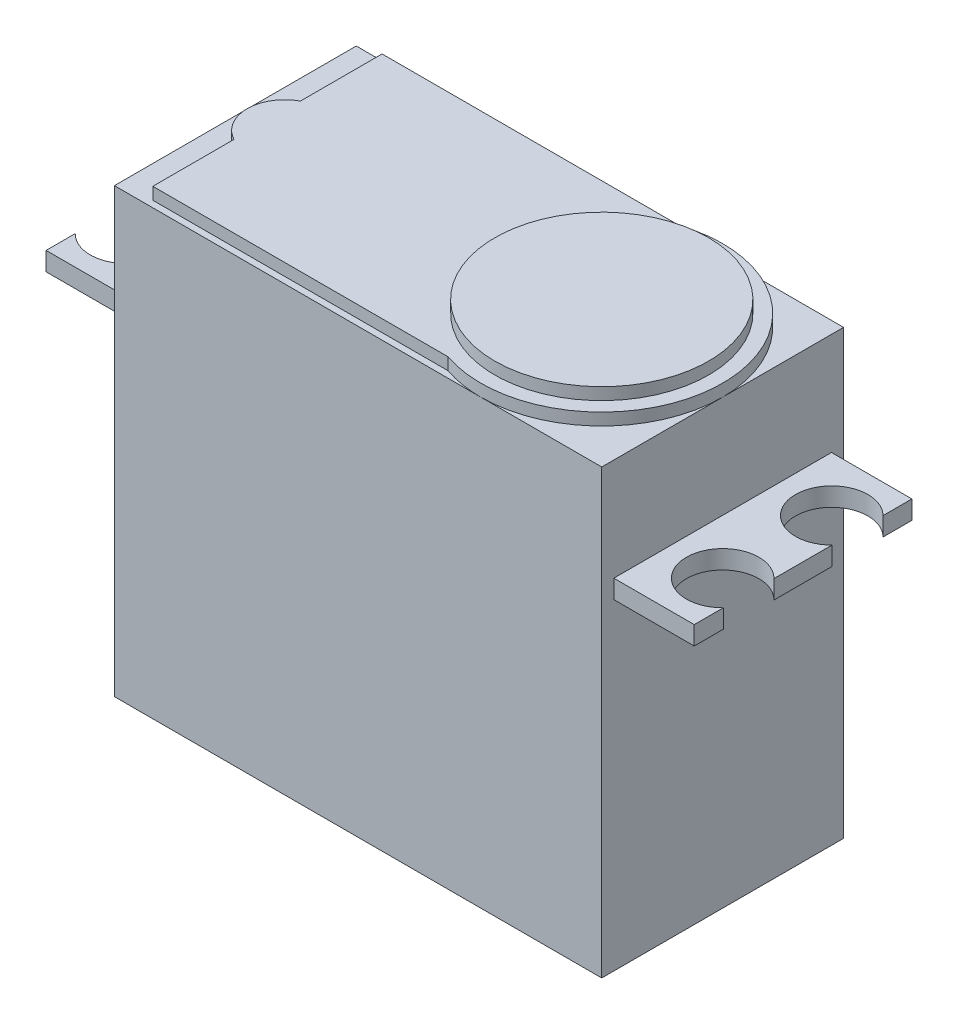
ISO-10303-21;
HEADER;
FILE_DESCRIPTION(('STEP AP214'),'2;1');
FILE_NAME('part.step','',(''),(''),'','','');
FILE_SCHEMA(('AUTOMOTIVE_DESIGN { 1 0 10303 214 1 1 1 1 }'));
ENDSEC;
DATA;
#1=APPLICATION_CONTEXT('core data for automotive mechanical design processes');
#2=APPLICATION_PROTOCOL_DEFINITION('international standard','automotive_design',2000,#1);
#3=PRODUCT_CONTEXT('',#1,'mechanical');
#4=PRODUCT('Part','Part','',(#3));
#5=PRODUCT_RELATED_PRODUCT_CATEGORY('part','',(#4));
#6=PRODUCT_DEFINITION_FORMATION('','',#4);
#7=PRODUCT_DEFINITION_CONTEXT('part definition',#1,'design');
#8=PRODUCT_DEFINITION('design','',#6,#7);
#9=PRODUCT_DEFINITION_SHAPE('','',#8);
#10=(LENGTH_UNIT() NAMED_UNIT(*) SI_UNIT(.MILLI.,.METRE.));
#11=(NAMED_UNIT(*) PLANE_ANGLE_UNIT() SI_UNIT($,.RADIAN.));
#12=(NAMED_UNIT(*) SI_UNIT($,.STERADIAN.) SOLID_ANGLE_UNIT());
#13=UNCERTAINTY_MEASURE_WITH_UNIT(LENGTH_MEASURE(1.E-05),#10,'distance_accuracy_value','');
#14=(GEOMETRIC_REPRESENTATION_CONTEXT(3) GLOBAL_UNCERTAINTY_ASSIGNED_CONTEXT((#13)) GLOBAL_UNIT_ASSIGNED_CONTEXT((#10,
#11,#12)) REPRESENTATION_CONTEXT('',''));
#15=CARTESIAN_POINT('',(0.,0.,0.));
#16=DIRECTION('',(0.,0.,1.));
#17=DIRECTION('',(1.,0.,0.));
#18=AXIS2_PLACEMENT_3D('',#15,#16,#17);
#19=CARTESIAN_POINT('',(-32.6652666539174,0.,0.));
#20=DIRECTION('',(-1.,0.,0.));
#21=DIRECTION('',(0.,0.,1.));
#22=AXIS2_PLACEMENT_3D('',#19,#20,#21);
#23=PLANE('',#22);
#24=DIRECTION('',(0.,1.,0.));
#25=VECTOR('',#24,1.);
#26=CARTESIAN_POINT('',(-32.6652666539174,0.,-2.7555980629411));
#27=LINE('',#26,#25);
#28=CARTESIAN_POINT('',(-32.6652666539174,26.6,-2.75559806294112));
#29=VERTEX_POINT('',#28);
#30=CARTESIAN_POINT('',(-32.6652666539174,28.1360986923512,-2.75559806294112));
#31=VERTEX_POINT('',#30);
#32=EDGE_CURVE('E12',#29,#31,#27,.T.);
#33=ORIENTED_EDGE('',*,*,#32,.F.);
#34=DIRECTION('',(0.,0.,1.));
#35=VECTOR('',#34,1.);
#36=CARTESIAN_POINT('',(-32.6652666539174,26.6,-9.3478456582319));
#37=LINE('',#36,#35);
#38=CARTESIAN_POINT('',(-32.6652666539174,26.6,2.05990674647734));
#39=VERTEX_POINT('',#38);
#40=EDGE_CURVE('E373',#29,#39,#37,.T.);
#41=ORIENTED_EDGE('',*,*,#40,.T.);
#42=DIRECTION('',(0.,1.,0.));
#43=VECTOR('',#42,1.);
#44=CARTESIAN_POINT('',(-32.6652666539174,0.,2.05990674647736));
#45=LINE('',#44,#43);
#46=CARTESIAN_POINT('',(-32.6652666539174,28.1360986923512,2.05990674647733));
#47=VERTEX_POINT('',#46);
#48=EDGE_CURVE('E581',#47,#39,#45,.F.);
#49=ORIENTED_EDGE('',*,*,#48,.F.);
#50=DIRECTION('',(0.,0.,-1.));
#51=VECTOR('',#50,1.);
#52=CARTESIAN_POINT('',(-32.6652666539174,28.1360986923512,-9.3478456582319));
#53=LINE('',#52,#51);
#54=EDGE_CURVE('E383',#47,#31,#53,.T.);
#55=ORIENTED_EDGE('',*,*,#54,.T.);
#56=EDGE_LOOP('',(#33,#41,#49,#55));
#57=FACE_BOUND('',#56,.T.);
#58=ADVANCED_FACE('F73',(#57),#23,.T.);
#59=DIRECTION('',(0.,1.,0.));
#60=VECTOR('',#59,1.);
#61=CARTESIAN_POINT('',(-32.6652666539174,0.,6.2444019370589));
#62=LINE('',#61,#60);
#63=CARTESIAN_POINT('',(-32.6652666539174,26.6,6.24440193705888));
#64=VERTEX_POINT('',#63);
#65=CARTESIAN_POINT('',(-32.6652666539174,28.1360986923512,6.24440193705888));
#66=VERTEX_POINT('',#65);
#67=EDGE_CURVE('E584',#64,#66,#62,.T.);
#68=ORIENTED_EDGE('',*,*,#67,.F.);
#69=CARTESIAN_POINT('',(-32.6652666539174,26.6,8.6521543417681));
#70=VERTEX_POINT('',#69);
#71=EDGE_CURVE('E367',#64,#70,#37,.T.);
#72=ORIENTED_EDGE('',*,*,#71,.T.);
#73=DIRECTION('',(0.,1.,0.));
#74=VECTOR('',#73,1.);
#75=CARTESIAN_POINT('',(-32.6652666539174,28.1360986923512,8.6521543417681));
#76=LINE('',#75,#74);
#77=CARTESIAN_POINT('',(-32.6652666539174,28.1360986923512,8.6521543417681));
#78=VERTEX_POINT('',#77);
#79=EDGE_CURVE('E372',#70,#78,#76,.T.);
#80=ORIENTED_EDGE('',*,*,#79,.T.);
#81=EDGE_CURVE('E378',#78,#66,#53,.T.);
#82=ORIENTED_EDGE('',*,*,#81,.T.);
#83=EDGE_LOOP('',(#68,#72,#80,#82));
#84=FACE_BOUND('',#83,.T.);
#85=ADVANCED_FACE('F622',(#84),#23,.T.);
#86=CARTESIAN_POINT('',(20.9347333460826,0.,0.));
#87=DIRECTION('',(-1.,0.,0.));
#88=DIRECTION('',(0.,0.,1.));
#89=AXIS2_PLACEMENT_3D('',#86,#87,#88);
#90=PLANE('',#89);
#91=DIRECTION('',(0.,0.,1.));
#92=VECTOR('',#91,1.);
#93=CARTESIAN_POINT('',(20.9347333460826,26.6,-9.34784565823191));
#94=LINE('',#93,#92);
#95=CARTESIAN_POINT('',(20.9347333460826,26.6,-2.73579650099915));
#96=VERTEX_POINT('',#95);
#97=CARTESIAN_POINT('',(20.9347333460826,26.6,2.05988573221088));
#98=VERTEX_POINT('',#97);
#99=EDGE_CURVE('E393',#96,#98,#94,.T.);
#100=ORIENTED_EDGE('',*,*,#99,.F.);
#101=DIRECTION('',(0.,1.,0.));
#102=VECTOR('',#101,1.);
#103=CARTESIAN_POINT('',(20.9347333460826,0.,-2.73579650099913));
#104=LINE('',#103,#102);
#105=CARTESIAN_POINT('',(20.9347333460826,28.1360986923512,-2.73579650099915));
#106=VERTEX_POINT('',#105);
#107=EDGE_CURVE('E359',#96,#106,#104,.T.);
#108=ORIENTED_EDGE('',*,*,#107,.T.);
#109=DIRECTION('',(0.,0.,-1.));
#110=VECTOR('',#109,1.);
#111=CARTESIAN_POINT('',(20.9347333460826,28.1360986923512,-9.34784565823191));
#112=LINE('',#111,#110);
#113=CARTESIAN_POINT('',(20.9347333460826,28.1360986923512,2.05988573221088));
#114=VERTEX_POINT('',#113);
#115=EDGE_CURVE('E403',#114,#106,#112,.T.);
#116=ORIENTED_EDGE('',*,*,#115,.F.);
#117=DIRECTION('',(0.,1.,0.));
#118=VECTOR('',#117,1.);
#119=CARTESIAN_POINT('',(20.9347333460826,0.,2.0598857322109));
#120=LINE('',#119,#118);
#121=EDGE_CURVE('E344',#114,#98,#120,.F.);
#122=ORIENTED_EDGE('',*,*,#121,.T.);
#123=EDGE_LOOP('',(#100,#108,#116,#122));
#124=FACE_BOUND('',#123,.T.);
#125=ADVANCED_FACE('F688',(#124),#90,.F.);
#126=CARTESIAN_POINT('',(20.9347333460826,26.6,6.2443809227924));
#127=VERTEX_POINT('',#126);
#128=CARTESIAN_POINT('',(20.9347333460826,26.6,8.65215434176809));
#129=VERTEX_POINT('',#128);
#130=EDGE_CURVE('E387',#127,#129,#94,.T.);
#131=ORIENTED_EDGE('',*,*,#130,.F.);
#132=DIRECTION('',(0.,1.,0.));
#133=VECTOR('',#132,1.);
#134=CARTESIAN_POINT('',(20.9347333460826,0.,6.24438092279243));
#135=LINE('',#134,#133);
#136=CARTESIAN_POINT('',(20.9347333460826,28.1360986923512,6.2443809227924));
#137=VERTEX_POINT('',#136);
#138=EDGE_CURVE('E348',#127,#137,#135,.T.);
#139=ORIENTED_EDGE('',*,*,#138,.T.);
#140=CARTESIAN_POINT('',(20.9347333460826,28.1360986923512,8.65215434176809));
#141=VERTEX_POINT('',#140);
#142=EDGE_CURVE('E398',#141,#137,#112,.T.);
#143=ORIENTED_EDGE('',*,*,#142,.F.);
#144=DIRECTION('',(0.,1.,0.));
#145=VECTOR('',#144,1.);
#146=CARTESIAN_POINT('',(20.9347333460826,28.1360986923512,8.65215434176809));
#147=LINE('',#146,#145);
#148=EDGE_CURVE('E392',#129,#141,#147,.T.);
#149=ORIENTED_EDGE('',*,*,#148,.F.);
#150=EDGE_LOOP('',(#131,#139,#143,#149));
#151=FACE_BOUND('',#150,.T.);
#152=ADVANCED_FACE('F719',(#151),#90,.F.);
#153=CARTESIAN_POINT('',(0.,36.6,0.));
#154=DIRECTION('',(0.,-1.,0.));
#155=DIRECTION('',(0.,0.,-1.));
#156=AXIS2_PLACEMENT_3D('',#153,#154,#155);
#157=PLANE('',#156);
#158=CARTESIAN_POINT('',(4.28473334608257,36.6,-0.347845658231897));
#159=DIRECTION('',(0.,1.,0.));
#160=DIRECTION('',(0.,0.,1.));
#161=AXIS2_PLACEMENT_3D('',#158,#159,#160);
#162=CIRCLE('',#161,10.);
#163=CARTESIAN_POINT('',(14.2847333460826,36.6,-0.347845658231897));
#164=VERTEX_POINT('',#163);
#165=CARTESIAN_POINT('',(4.28473334608257,36.6,-10.3478456582319));
#166=VERTEX_POINT('',#165);
#167=EDGE_CURVE('E642',#164,#166,#162,.T.);
#168=ORIENTED_EDGE('',*,*,#167,.F.);
#169=DIRECTION('',(0.,0.,1.));
#170=VECTOR('',#169,1.);
#171=CARTESIAN_POINT('',(14.2847333460826,36.6,-10.3478456582319));
#172=LINE('',#171,#170);
#173=CARTESIAN_POINT('',(14.2847333460826,36.6,-10.3478456582319));
#174=VERTEX_POINT('',#173);
#175=EDGE_CURVE('E516',#174,#164,#172,.T.);
#176=ORIENTED_EDGE('',*,*,#175,.F.);
#177=DIRECTION('',(1.,0.,0.));
#178=VECTOR('',#177,1.);
#179=CARTESIAN_POINT('',(-26.0152666539174,36.6,-10.3478456582319));
#180=LINE('',#179,#178);
#181=EDGE_CURVE('E515',#166,#174,#180,.T.);
#182=ORIENTED_EDGE('',*,*,#181,.F.);
#183=EDGE_LOOP('',(#168,#176,#182));
#184=FACE_BOUND('',#183,.T.);
#185=ADVANCED_FACE('F875',(#184),#157,.F.);
#186=CARTESIAN_POINT('',(4.28473334608257,36.6,9.6521543417681));
#187=VERTEX_POINT('',#186);
#188=EDGE_CURVE('E498',#187,#164,#162,.T.);
#189=ORIENTED_EDGE('',*,*,#188,.F.);
#190=DIRECTION('',(1.,0.,0.));
#191=VECTOR('',#190,1.);
#192=CARTESIAN_POINT('',(-26.0152666539174,36.6,9.6521543417681));
#193=LINE('',#192,#191);
#194=CARTESIAN_POINT('',(14.2847333460826,36.6,9.6521543417681));
#195=VERTEX_POINT('',#194);
#196=EDGE_CURVE('E520',#187,#195,#193,.T.);
#197=ORIENTED_EDGE('',*,*,#196,.T.);
#198=EDGE_CURVE('E514',#164,#195,#172,.T.);
#199=ORIENTED_EDGE('',*,*,#198,.F.);
#200=EDGE_LOOP('',(#189,#197,#199));
#201=FACE_BOUND('',#200,.T.);
#202=ADVANCED_FACE('F1001',(#201),#157,.F.);
#203=CARTESIAN_POINT('',(-26.0152666539174,36.6,-10.3478456582319));
#204=DIRECTION('',(0.,0.,-1.));
#205=DIRECTION('',(-1.,0.,0.));
#206=AXIS2_PLACEMENT_3D('',#203,#204,#205);
#207=PLANE('',#206);
#208=DIRECTION('',(1.,0.,0.));
#209=VECTOR('',#208,1.);
#210=CARTESIAN_POINT('',(-26.0152666539174,0.,-10.3478456582319));
#211=LINE('',#210,#209);
#212=CARTESIAN_POINT('',(-26.0152666539174,0.,-10.3478456582319));
#213=VERTEX_POINT('',#212);
#214=CARTESIAN_POINT('',(14.2847333460826,0.,-10.3478456582319));
#215=VERTEX_POINT('',#214);
#216=EDGE_CURVE('E509',#213,#215,#211,.T.);
#217=ORIENTED_EDGE('',*,*,#216,.F.);
#218=DIRECTION('',(0.,-1.,0.));
#219=VECTOR('',#218,1.);
#220=CARTESIAN_POINT('',(-26.0152666539174,36.6,-10.3478456582319));
#221=LINE('',#220,#219);
#222=CARTESIAN_POINT('',(-26.0152666539174,36.6,-10.3478456582319));
#223=VERTEX_POINT('',#222);
#224=EDGE_CURVE('E543',#223,#213,#221,.T.);
#225=ORIENTED_EDGE('',*,*,#224,.F.);
#226=EDGE_CURVE('E510',#223,#166,#180,.T.);
#227=ORIENTED_EDGE('',*,*,#226,.T.);
#228=ORIENTED_EDGE('',*,*,#181,.T.);
#229=DIRECTION('',(0.,-1.,0.));
#230=VECTOR('',#229,1.);
#231=CARTESIAN_POINT('',(14.2847333460826,36.6,-10.3478456582319));
#232=LINE('',#231,#230);
#233=EDGE_CURVE('E528',#174,#215,#232,.T.);
#234=ORIENTED_EDGE('',*,*,#233,.T.);
#235=EDGE_LOOP('',(#217,#225,#227,#228,#234));
#236=FACE_BOUND('',#235,.T.);
#237=ADVANCED_FACE('F75',(#236),#207,.T.);
#238=CARTESIAN_POINT('',(-26.0152666539174,36.6,-10.3478456582319));
#239=DIRECTION('',(1.,0.,0.));
#240=DIRECTION('',(0.,0.,-1.));
#241=AXIS2_PLACEMENT_3D('',#238,#239,#240);
#242=PLANE('',#241);
#243=DIRECTION('',(0.,-1.,0.));
#244=VECTOR('',#243,1.);
#245=CARTESIAN_POINT('',(-26.0152666539174,7.,-3.8478456582319));
#246=LINE('',#245,#244);
#247=CARTESIAN_POINT('',(-26.0152666539174,7.,-3.8478456582319));
#248=VERTEX_POINT('',#247);
#249=CARTESIAN_POINT('',(-26.0152666539174,4.,-3.8478456582319));
#250=VERTEX_POINT('',#249);
#251=EDGE_CURVE('E307',#248,#250,#246,.T.);
#252=ORIENTED_EDGE('',*,*,#251,.F.);
#253=DIRECTION('',(0.,0.,1.));
#254=VECTOR('',#253,1.);
#255=CARTESIAN_POINT('',(-26.0152666539174,7.,-3.8478456582319));
#256=LINE('',#255,#254);
#257=CARTESIAN_POINT('',(-26.0152666539174,7.,3.1521543417681));
#258=VERTEX_POINT('',#257);
#259=EDGE_CURVE('E316',#248,#258,#256,.T.);
#260=ORIENTED_EDGE('',*,*,#259,.T.);
#261=DIRECTION('',(0.,-1.,0.));
#262=VECTOR('',#261,1.);
#263=CARTESIAN_POINT('',(-26.0152666539174,7.,3.1521543417681));
#264=LINE('',#263,#262);
#265=CARTESIAN_POINT('',(-26.0152666539174,4.,3.15215434176811));
#266=VERTEX_POINT('',#265);
#267=EDGE_CURVE('E286',#258,#266,#264,.T.);
#268=ORIENTED_EDGE('',*,*,#267,.T.);
#269=DIRECTION('',(0.,0.,1.));
#270=VECTOR('',#269,1.);
#271=CARTESIAN_POINT('',(-26.0152666539174,4.,-3.8478456582319));
#272=LINE('',#271,#270);
#273=EDGE_CURVE('E89',#250,#266,#272,.T.);
#274=ORIENTED_EDGE('',*,*,#273,.F.);
#275=EDGE_LOOP('',(#252,#260,#268,#274));
#276=FACE_BOUND('',#275,.T.);
#277=DIRECTION('',(0.,0.,-1.));
#278=VECTOR('',#277,1.);
#279=CARTESIAN_POINT('',(-26.0152666539174,26.6,-10.3478456582319));
#280=LINE('',#279,#278);
#281=CARTESIAN_POINT('',(-26.0152666539174,26.6,8.6521543417681));
#282=VERTEX_POINT('',#281);
#283=CARTESIAN_POINT('',(-26.0152666539174,26.6,-9.34784565823191));
#284=VERTEX_POINT('',#283);
#285=EDGE_CURVE('E408',#282,#284,#280,.T.);
#286=ORIENTED_EDGE('',*,*,#285,.T.);
#287=DIRECTION('',(0.,1.,0.));
#288=VECTOR('',#287,1.);
#289=CARTESIAN_POINT('',(-26.0152666539174,36.6,-9.3478456582319));
#290=LINE('',#289,#288);
#291=CARTESIAN_POINT('',(-26.0152666539174,28.1360986923512,-9.3478456582319));
#292=VERTEX_POINT('',#291);
#293=EDGE_CURVE('E435',#284,#292,#290,.T.);
#294=ORIENTED_EDGE('',*,*,#293,.T.);
#295=DIRECTION('',(0.,0.,1.));
#296=VECTOR('',#295,1.);
#297=CARTESIAN_POINT('',(-26.0152666539174,28.1360986923512,-10.3478456582319));
#298=LINE('',#297,#296);
#299=CARTESIAN_POINT('',(-26.0152666539174,28.1360986923512,8.6521543417681));
#300=VERTEX_POINT('',#299);
#301=EDGE_CURVE('E431',#292,#300,#298,.T.);
#302=ORIENTED_EDGE('',*,*,#301,.T.);
#303=DIRECTION('',(0.,-1.,0.));
#304=VECTOR('',#303,1.);
#305=CARTESIAN_POINT('',(-26.0152666539174,36.6,8.6521543417681));
#306=LINE('',#305,#304);
#307=EDGE_CURVE('E427',#300,#282,#306,.T.);
#308=ORIENTED_EDGE('',*,*,#307,.T.);
#309=EDGE_LOOP('',(#286,#294,#302,#308));
#310=FACE_BOUND('',#309,.T.);
#311=DIRECTION('',(0.,0.,1.));
#312=VECTOR('',#311,1.);
#313=CARTESIAN_POINT('',(-26.0152666539174,0.,-10.3478456582319));
#314=LINE('',#313,#312);
#315=CARTESIAN_POINT('',(-26.0152666539174,0.,9.6521543417681));
#316=VERTEX_POINT('',#315);
#317=EDGE_CURVE('E540',#213,#316,#314,.T.);
#318=ORIENTED_EDGE('',*,*,#317,.T.);
#319=DIRECTION('',(0.,-1.,0.));
#320=VECTOR('',#319,1.);
#321=CARTESIAN_POINT('',(-26.0152666539174,36.6,9.6521543417681));
#322=LINE('',#321,#320);
#323=CARTESIAN_POINT('',(-26.0152666539174,36.6,9.6521543417681));
#324=VERTEX_POINT('',#323);
#325=EDGE_CURVE('E546',#324,#316,#322,.T.);
#326=ORIENTED_EDGE('',*,*,#325,.F.);
#327=DIRECTION('',(0.,0.,1.));
#328=VECTOR('',#327,1.);
#329=CARTESIAN_POINT('',(-26.0152666539174,36.6,-10.3478456582319));
#330=LINE('',#329,#328);
#331=EDGE_CURVE('E525',#223,#324,#330,.T.);
#332=ORIENTED_EDGE('',*,*,#331,.F.);
#333=ORIENTED_EDGE('',*,*,#224,.T.);
#334=EDGE_LOOP('',(#318,#326,#332,#333));
#335=FACE_BOUND('',#334,.T.);
#336=ADVANCED_FACE('F1009',(#276,#310,#335),#242,.F.);
#337=CARTESIAN_POINT('',(-26.0152666539174,36.6,9.6521543417681));
#338=DIRECTION('',(0.,0.,-1.));
#339=DIRECTION('',(-1.,0.,0.));
#340=AXIS2_PLACEMENT_3D('',#337,#338,#339);
#341=PLANE('',#340);
#342=DIRECTION('',(1.,0.,0.));
#343=VECTOR('',#342,1.);
#344=CARTESIAN_POINT('',(-26.0152666539174,0.,9.6521543417681));
#345=LINE('',#344,#343);
#346=CARTESIAN_POINT('',(14.2847333460826,0.,9.6521543417681));
#347=VERTEX_POINT('',#346);
#348=EDGE_CURVE('E536',#316,#347,#345,.T.);
#349=ORIENTED_EDGE('',*,*,#348,.T.);
#350=DIRECTION('',(0.,-1.,0.));
#351=VECTOR('',#350,1.);
#352=CARTESIAN_POINT('',(14.2847333460826,36.6,9.6521543417681));
#353=LINE('',#352,#351);
#354=EDGE_CURVE('E550',#195,#347,#353,.T.);
#355=ORIENTED_EDGE('',*,*,#354,.F.);
#356=ORIENTED_EDGE('',*,*,#196,.F.);
#357=EDGE_CURVE('E521',#324,#187,#193,.T.);
#358=ORIENTED_EDGE('',*,*,#357,.F.);
#359=ORIENTED_EDGE('',*,*,#325,.T.);
#360=EDGE_LOOP('',(#349,#355,#356,#358,#359));
#361=FACE_BOUND('',#360,.T.);
#362=ADVANCED_FACE('F912',(#361),#341,.F.);
#363=CARTESIAN_POINT('',(14.2847333460826,36.6,-10.3478456582319));
#364=DIRECTION('',(1.,0.,0.));
#365=DIRECTION('',(0.,0.,-1.));
#366=AXIS2_PLACEMENT_3D('',#363,#364,#365);
#367=PLANE('',#366);
#368=DIRECTION('',(0.,1.,0.));
#369=VECTOR('',#368,1.);
#370=CARTESIAN_POINT('',(14.2847333460826,36.6,-9.34784565823191));
#371=LINE('',#370,#369);
#372=CARTESIAN_POINT('',(14.2847333460826,26.6,-9.34784565823191));
#373=VERTEX_POINT('',#372);
#374=CARTESIAN_POINT('',(14.2847333460826,28.1360986923512,-9.34784565823191));
#375=VERTEX_POINT('',#374);
#376=EDGE_CURVE('E571',#373,#375,#371,.T.);
#377=ORIENTED_EDGE('',*,*,#376,.F.);
#378=DIRECTION('',(0.,0.,-1.));
#379=VECTOR('',#378,1.);
#380=CARTESIAN_POINT('',(14.2847333460826,26.6,-10.3478456582319));
#381=LINE('',#380,#379);
#382=CARTESIAN_POINT('',(14.2847333460826,26.6,8.6521543417681));
#383=VERTEX_POINT('',#382);
#384=EDGE_CURVE('E559',#383,#373,#381,.T.);
#385=ORIENTED_EDGE('',*,*,#384,.F.);
#386=DIRECTION('',(0.,-1.,0.));
#387=VECTOR('',#386,1.);
#388=CARTESIAN_POINT('',(14.2847333460826,36.6,8.65215434176809));
#389=LINE('',#388,#387);
#390=CARTESIAN_POINT('',(14.2847333460826,28.1360986923512,8.65215434176809));
#391=VERTEX_POINT('',#390);
#392=EDGE_CURVE('E563',#391,#383,#389,.T.);
#393=ORIENTED_EDGE('',*,*,#392,.F.);
#394=DIRECTION('',(0.,0.,1.));
#395=VECTOR('',#394,1.);
#396=CARTESIAN_POINT('',(14.2847333460826,28.1360986923512,-10.3478456582319));
#397=LINE('',#396,#395);
#398=EDGE_CURVE('E567',#375,#391,#397,.T.);
#399=ORIENTED_EDGE('',*,*,#398,.F.);
#400=EDGE_LOOP('',(#377,#385,#393,#399));
#401=FACE_BOUND('',#400,.T.);
#402=DIRECTION('',(0.,0.,1.));
#403=VECTOR('',#402,1.);
#404=CARTESIAN_POINT('',(14.2847333460826,0.,-10.3478456582319));
#405=LINE('',#404,#403);
#406=EDGE_CURVE('E532',#215,#347,#405,.T.);
#407=ORIENTED_EDGE('',*,*,#406,.F.);
#408=ORIENTED_EDGE('',*,*,#233,.F.);
#409=ORIENTED_EDGE('',*,*,#175,.T.);
#410=ORIENTED_EDGE('',*,*,#198,.T.);
#411=ORIENTED_EDGE('',*,*,#354,.T.);
#412=EDGE_LOOP('',(#407,#408,#409,#410,#411));
#413=FACE_BOUND('',#412,.T.);
#414=ADVANCED_FACE('F736',(#401,#413),#367,.T.);
#415=DIRECTION('',(0.,0.,1.));
#416=VECTOR('',#415,1.);
#417=CARTESIAN_POINT('',(-23.3801683178774,36.6,-9.8478456582319));
#418=LINE('',#417,#416);
#419=CARTESIAN_POINT('',(-23.3801683178774,36.6,-9.8478456582319));
#420=VERTEX_POINT('',#419);
#421=CARTESIAN_POINT('',(-23.3801683178774,36.6,-3.09417730499386));
#422=VERTEX_POINT('',#421);
#423=EDGE_CURVE('E449',#420,#422,#418,.T.);
#424=ORIENTED_EDGE('',*,*,#423,.F.);
#425=DIRECTION('',(1.,0.,0.));
#426=VECTOR('',#425,1.);
#427=CARTESIAN_POINT('',(-23.3801683178774,36.6,-9.8478456582319));
#428=LINE('',#427,#426);
#429=CARTESIAN_POINT('',(1.16223434688337,36.6,-9.8478456582319));
#430=VERTEX_POINT('',#429);
#431=EDGE_CURVE('E459',#420,#430,#428,.T.);
#432=ORIENTED_EDGE('',*,*,#431,.T.);
#433=EDGE_CURVE('E497',#166,#430,#162,.T.);
#434=ORIENTED_EDGE('',*,*,#433,.F.);
#435=ORIENTED_EDGE('',*,*,#226,.F.);
#436=ORIENTED_EDGE('',*,*,#331,.T.);
#437=ORIENTED_EDGE('',*,*,#357,.T.);
#438=CARTESIAN_POINT('',(1.04513170593084,36.6,9.11286156761154));
#439=VERTEX_POINT('',#438);
#440=EDGE_CURVE('E443',#439,#187,#162,.T.);
#441=ORIENTED_EDGE('',*,*,#440,.F.);
#442=DIRECTION('',(1.,0.,0.));
#443=VECTOR('',#442,1.);
#444=CARTESIAN_POINT('',(-23.3801683178774,36.6,9.11286156761154));
#445=LINE('',#444,#443);
#446=CARTESIAN_POINT('',(-23.3801683178774,36.6,9.11286156761154));
#447=VERTEX_POINT('',#446);
#448=EDGE_CURVE('E462',#447,#439,#445,.T.);
#449=ORIENTED_EDGE('',*,*,#448,.F.);
#450=CARTESIAN_POINT('',(-23.3801683178774,36.6,2.39848598853006));
#451=VERTEX_POINT('',#450);
#452=EDGE_CURVE('E467',#451,#447,#418,.T.);
#453=ORIENTED_EDGE('',*,*,#452,.F.);
#454=CARTESIAN_POINT('',(-21.9343627559939,36.6,-0.347845658231897));
#455=DIRECTION('',(0.,1.,0.));
#456=DIRECTION('',(0.,0.,1.));
#457=AXIS2_PLACEMENT_3D('',#454,#455,#456);
#458=CIRCLE('',#457,3.10365771901147);
#459=EDGE_CURVE('E486',#422,#451,#458,.T.);
#460=ORIENTED_EDGE('',*,*,#459,.F.);
#461=EDGE_LOOP('',(#424,#432,#434,#435,#436,#437,#441,#449,#453,#460));
#462=FACE_BOUND('',#461,.T.);
#463=ADVANCED_FACE('F663',(#462),#157,.F.);
#464=CARTESIAN_POINT('',(0.,0.,0.));
#465=DIRECTION('',(0.,-1.,0.));
#466=DIRECTION('',(0.,0.,-1.));
#467=AXIS2_PLACEMENT_3D('',#464,#465,#466);
#468=PLANE('',#467);
#469=ORIENTED_EDGE('',*,*,#216,.T.);
#470=ORIENTED_EDGE('',*,*,#406,.T.);
#471=ORIENTED_EDGE('',*,*,#348,.F.);
#472=ORIENTED_EDGE('',*,*,#317,.F.);
#473=EDGE_LOOP('',(#469,#470,#471,#472));
#474=FACE_BOUND('',#473,.T.);
#475=ADVANCED_FACE('F991',(#474),#468,.T.);
#476=CARTESIAN_POINT('',(-23.3801683178774,37.6,9.11286156761154));
#477=DIRECTION('',(0.,0.,-1.));
#478=DIRECTION('',(-1.,0.,0.));
#479=AXIS2_PLACEMENT_3D('',#476,#477,#478);
#480=PLANE('',#479);
#481=DIRECTION('',(0.,-1.,0.));
#482=VECTOR('',#481,1.);
#483=CARTESIAN_POINT('',(1.04513170593084,37.6,9.11286156761154));
#484=LINE('',#483,#482);
#485=CARTESIAN_POINT('',(1.04513170593084,37.6,9.11286156761154));
#486=VERTEX_POINT('',#485);
#487=EDGE_CURVE('E475',#486,#439,#484,.T.);
#488=ORIENTED_EDGE('',*,*,#487,.F.);
#489=DIRECTION('',(1.,0.,0.));
#490=VECTOR('',#489,1.);
#491=CARTESIAN_POINT('',(-23.3801683178774,37.6,9.11286156761154));
#492=LINE('',#491,#490);
#493=CARTESIAN_POINT('',(-23.3801683178774,37.6,9.11286156761154));
#494=VERTEX_POINT('',#493);
#495=EDGE_CURVE('E448',#494,#486,#492,.T.);
#496=ORIENTED_EDGE('',*,*,#495,.F.);
#497=DIRECTION('',(0.,-1.,0.));
#498=VECTOR('',#497,1.);
#499=CARTESIAN_POINT('',(-23.3801683178774,37.6,9.11286156761154));
#500=LINE('',#499,#498);
#501=EDGE_CURVE('E476',#494,#447,#500,.T.);
#502=ORIENTED_EDGE('',*,*,#501,.T.);
#503=ORIENTED_EDGE('',*,*,#448,.T.);
#504=EDGE_LOOP('',(#488,#496,#502,#503));
#505=FACE_BOUND('',#504,.T.);
#506=ADVANCED_FACE('F661',(#505),#480,.F.);
#507=CARTESIAN_POINT('',(-23.3801683178774,37.6,-9.8478456582319));
#508=DIRECTION('',(0.,0.,-1.));
#509=DIRECTION('',(-1.,0.,0.));
#510=AXIS2_PLACEMENT_3D('',#507,#508,#509);
#511=PLANE('',#510);
#512=ORIENTED_EDGE('',*,*,#431,.F.);
#513=DIRECTION('',(0.,-1.,0.));
#514=VECTOR('',#513,1.);
#515=CARTESIAN_POINT('',(-23.3801683178774,37.6,-9.8478456582319));
#516=LINE('',#515,#514);
#517=CARTESIAN_POINT('',(-23.3801683178774,37.6,-9.8478456582319));
#518=VERTEX_POINT('',#517);
#519=EDGE_CURVE('E471',#518,#420,#516,.T.);
#520=ORIENTED_EDGE('',*,*,#519,.F.);
#521=DIRECTION('',(1.,0.,0.));
#522=VECTOR('',#521,1.);
#523=CARTESIAN_POINT('',(-23.3801683178774,37.6,-9.8478456582319));
#524=LINE('',#523,#522);
#525=CARTESIAN_POINT('',(1.16223434688337,37.6,-9.8478456582319));
#526=VERTEX_POINT('',#525);
#527=EDGE_CURVE('E444',#518,#526,#524,.T.);
#528=ORIENTED_EDGE('',*,*,#527,.T.);
#529=DIRECTION('',(0.,-1.,0.));
#530=VECTOR('',#529,1.);
#531=CARTESIAN_POINT('',(1.16223434688337,37.6,-9.8478456582319));
#532=LINE('',#531,#530);
#533=EDGE_CURVE('E458',#526,#430,#532,.T.);
#534=ORIENTED_EDGE('',*,*,#533,.T.);
#535=EDGE_LOOP('',(#512,#520,#528,#534));
#536=FACE_BOUND('',#535,.T.);
#537=ADVANCED_FACE('F654',(#536),#511,.T.);
#538=CARTESIAN_POINT('',(-23.3801683178774,37.6,-9.8478456582319));
#539=DIRECTION('',(1.,0.,0.));
#540=DIRECTION('',(0.,0.,-1.));
#541=AXIS2_PLACEMENT_3D('',#538,#539,#540);
#542=PLANE('',#541);
#543=DIRECTION('',(0.,-1.,0.));
#544=VECTOR('',#543,1.);
#545=CARTESIAN_POINT('',(-23.3801683178774,37.6,-3.09417730499386));
#546=LINE('',#545,#544);
#547=CARTESIAN_POINT('',(-23.3801683178774,37.6,-3.09417730499386));
#548=VERTEX_POINT('',#547);
#549=EDGE_CURVE('E502',#548,#422,#546,.T.);
#550=ORIENTED_EDGE('',*,*,#549,.F.);
#551=DIRECTION('',(0.,0.,1.));
#552=VECTOR('',#551,1.);
#553=CARTESIAN_POINT('',(-23.3801683178774,37.6,-9.8478456582319));
#554=LINE('',#553,#552);
#555=EDGE_CURVE('E454',#518,#548,#554,.T.);
#556=ORIENTED_EDGE('',*,*,#555,.F.);
#557=ORIENTED_EDGE('',*,*,#519,.T.);
#558=ORIENTED_EDGE('',*,*,#423,.T.);
#559=EDGE_LOOP('',(#550,#556,#557,#558));
#560=FACE_BOUND('',#559,.T.);
#561=ADVANCED_FACE('F672',(#560),#542,.F.);
#562=DIRECTION('',(0.,-1.,0.));
#563=VECTOR('',#562,1.);
#564=CARTESIAN_POINT('',(-23.3801683178774,37.6,2.39848598853006));
#565=LINE('',#564,#563);
#566=CARTESIAN_POINT('',(-23.3801683178774,37.6,2.39848598853006));
#567=VERTEX_POINT('',#566);
#568=EDGE_CURVE('E506',#451,#567,#565,.F.);
#569=ORIENTED_EDGE('',*,*,#568,.F.);
#570=ORIENTED_EDGE('',*,*,#452,.T.);
#571=ORIENTED_EDGE('',*,*,#501,.F.);
#572=EDGE_CURVE('E453',#567,#494,#554,.T.);
#573=ORIENTED_EDGE('',*,*,#572,.F.);
#574=EDGE_LOOP('',(#569,#570,#571,#573));
#575=FACE_BOUND('',#574,.T.);
#576=ADVANCED_FACE('F666',(#575),#542,.F.);
#577=CARTESIAN_POINT('',(0.,37.6,0.));
#578=DIRECTION('',(0.,-1.,0.));
#579=DIRECTION('',(0.,0.,-1.));
#580=AXIS2_PLACEMENT_3D('',#577,#578,#579);
#581=PLANE('',#580);
#582=CARTESIAN_POINT('',(4.28473334608257,37.6,-0.347845658231897));
#583=DIRECTION('',(0.,-1.,0.));
#584=DIRECTION('',(0.,0.,-1.));
#585=AXIS2_PLACEMENT_3D('',#582,#583,#584);
#586=CIRCLE('',#585,8.84093689151189);
#587=CARTESIAN_POINT('',(4.28473334608257,37.6,-9.18878254974379));
#588=VERTEX_POINT('',#587);
#589=EDGE_CURVE('E555',#588,#588,#586,.F.);
#590=ORIENTED_EDGE('',*,*,#589,.F.);
#591=EDGE_LOOP('',(#590));
#592=FACE_BOUND('',#591,.T.);
#593=ORIENTED_EDGE('',*,*,#555,.T.);
#594=CARTESIAN_POINT('',(-21.9343627559939,37.6,-0.347845658231897));
#595=DIRECTION('',(0.,1.,0.));
#596=DIRECTION('',(0.,0.,1.));
#597=AXIS2_PLACEMENT_3D('',#594,#595,#596);
#598=CIRCLE('',#597,3.10365771901147);
#599=EDGE_CURVE('E463',#548,#567,#598,.T.);
#600=ORIENTED_EDGE('',*,*,#599,.T.);
#601=ORIENTED_EDGE('',*,*,#572,.T.);
#602=ORIENTED_EDGE('',*,*,#495,.T.);
#603=CARTESIAN_POINT('',(4.28473334608257,37.6,-0.347845658231897));
#604=DIRECTION('',(0.,1.,0.));
#605=DIRECTION('',(0.,0.,1.));
#606=AXIS2_PLACEMENT_3D('',#603,#604,#605);
#607=CIRCLE('',#606,10.);
#608=EDGE_CURVE('E490',#486,#526,#607,.T.);
#609=ORIENTED_EDGE('',*,*,#608,.T.);
#610=ORIENTED_EDGE('',*,*,#527,.F.);
#611=EDGE_LOOP('',(#593,#600,#601,#602,#609,#610));
#612=FACE_BOUND('',#611,.T.);
#613=ADVANCED_FACE('F658',(#592,#612),#581,.F.);
#614=CARTESIAN_POINT('',(4.28473334608257,37.6,-0.347845658231897));
#615=DIRECTION('',(0.,-1.,0.));
#616=DIRECTION('',(0.,0.,-1.));
#617=AXIS2_PLACEMENT_3D('',#614,#615,#616);
#618=CYLINDRICAL_SURFACE('',#617,10.);
#619=ORIENTED_EDGE('',*,*,#608,.F.);
#620=ORIENTED_EDGE('',*,*,#487,.T.);
#621=ORIENTED_EDGE('',*,*,#440,.T.);
#622=ORIENTED_EDGE('',*,*,#188,.T.);
#623=ORIENTED_EDGE('',*,*,#167,.T.);
#624=ORIENTED_EDGE('',*,*,#433,.T.);
#625=ORIENTED_EDGE('',*,*,#533,.F.);
#626=EDGE_LOOP('',(#619,#620,#621,#622,#623,#624,#625));
#627=FACE_BOUND('',#626,.T.);
#628=ADVANCED_FACE('F648',(#627),#618,.T.);
#629=CARTESIAN_POINT('',(-21.9343627559939,37.6,-0.347845658231897));
#630=DIRECTION('',(0.,-1.,0.));
#631=DIRECTION('',(0.,0.,-1.));
#632=AXIS2_PLACEMENT_3D('',#629,#630,#631);
#633=CYLINDRICAL_SURFACE('',#632,3.10365771901147);
#634=ORIENTED_EDGE('',*,*,#459,.T.);
#635=ORIENTED_EDGE('',*,*,#568,.T.);
#636=ORIENTED_EDGE('',*,*,#599,.F.);
#637=ORIENTED_EDGE('',*,*,#549,.T.);
#638=EDGE_LOOP('',(#634,#635,#636,#637));
#639=FACE_BOUND('',#638,.T.);
#640=ADVANCED_FACE('F670',(#639),#633,.T.);
#641=CARTESIAN_POINT('',(4.28473334608257,38.6,-0.347845658231897));
#642=DIRECTION('',(0.,-1.,0.));
#643=DIRECTION('',(0.,0.,-1.));
#644=AXIS2_PLACEMENT_3D('',#641,#642,#643);
#645=CYLINDRICAL_SURFACE('',#644,8.84093689151189);
#646=CARTESIAN_POINT('',(4.28473334608257,38.6,-0.347845658231897));
#647=DIRECTION('',(0.,1.,0.));
#648=DIRECTION('',(0.,0.,1.));
#649=AXIS2_PLACEMENT_3D('',#646,#647,#648);
#650=CIRCLE('',#649,8.84093689151189);
#651=CARTESIAN_POINT('',(4.28473334608257,38.6,8.49309123328));
#652=VERTEX_POINT('',#651);
#653=EDGE_CURVE('E439',#652,#652,#650,.T.);
#654=ORIENTED_EDGE('',*,*,#653,.F.);
#655=EDGE_LOOP('',(#654));
#656=FACE_BOUND('',#655,.T.);
#657=ORIENTED_EDGE('',*,*,#589,.T.);
#658=EDGE_LOOP('',(#657));
#659=FACE_BOUND('',#658,.T.);
#660=ADVANCED_FACE('F923',(#656,#659),#645,.T.);
#661=CARTESIAN_POINT('',(4.28473334608257,38.6,-0.347845658231897));
#662=DIRECTION('',(0.,1.,0.));
#663=DIRECTION('',(0.,0.,1.));
#664=AXIS2_PLACEMENT_3D('',#661,#662,#663);
#665=PLANE('',#664);
#666=ORIENTED_EDGE('',*,*,#653,.T.);
#667=EDGE_LOOP('',(#666));
#668=FACE_BOUND('',#667,.T.);
#669=ADVANCED_FACE('F717',(#668),#665,.T.);
#670=CARTESIAN_POINT('',(20.9347333460826,28.1360986923512,-6.95989481546468));
#671=VERTEX_POINT('',#670);
#672=CARTESIAN_POINT('',(20.9347333460826,28.1360986923512,-9.34784565823191));
#673=VERTEX_POINT('',#672);
#674=EDGE_CURVE('E397',#671,#673,#112,.T.);
#675=ORIENTED_EDGE('',*,*,#674,.F.);
#676=DIRECTION('',(0.,1.,0.));
#677=VECTOR('',#676,1.);
#678=CARTESIAN_POINT('',(20.9347333460826,0.,-6.95989481546466));
#679=LINE('',#678,#677);
#680=CARTESIAN_POINT('',(20.9347333460826,26.6,-6.95989481546468));
#681=VERTEX_POINT('',#680);
#682=EDGE_CURVE('E355',#671,#681,#679,.F.);
#683=ORIENTED_EDGE('',*,*,#682,.T.);
#684=CARTESIAN_POINT('',(20.9347333460826,26.6,-9.34784565823191));
#685=VERTEX_POINT('',#684);
#686=EDGE_CURVE('E388',#685,#681,#94,.T.);
#687=ORIENTED_EDGE('',*,*,#686,.F.);
#688=DIRECTION('',(0.,-1.,0.));
#689=VECTOR('',#688,1.);
#690=CARTESIAN_POINT('',(20.9347333460826,28.1360986923512,-9.34784565823191));
#691=LINE('',#690,#689);
#692=EDGE_CURVE('E382',#673,#685,#691,.T.);
#693=ORIENTED_EDGE('',*,*,#692,.F.);
#694=EDGE_LOOP('',(#675,#683,#687,#693));
#695=FACE_BOUND('',#694,.T.);
#696=ADVANCED_FACE('F709',(#695),#90,.F.);
#697=CARTESIAN_POINT('',(20.9347333460826,26.6,-9.34784565823191));
#698=DIRECTION('',(0.,-1.,0.));
#699=DIRECTION('',(0.,0.,-1.));
#700=AXIS2_PLACEMENT_3D('',#697,#698,#699);
#701=PLANE('',#700);
#702=CARTESIAN_POINT('',(18.8041821597845,26.6,-4.84784565823191));
#703=DIRECTION('',(0.,-1.,0.));
#704=DIRECTION('',(0.,0.,-1.));
#705=AXIS2_PLACEMENT_3D('',#702,#703,#704);
#706=CIRCLE('',#705,3.00000000000065);
#707=EDGE_CURVE('E352',#96,#681,#706,.T.);
#708=ORIENTED_EDGE('',*,*,#707,.F.);
#709=ORIENTED_EDGE('',*,*,#99,.T.);
#710=CARTESIAN_POINT('',(18.7847333460826,26.6,4.15213332750164));
#711=DIRECTION('',(0.,-1.,0.));
#712=DIRECTION('',(0.,0.,-1.));
#713=AXIS2_PLACEMENT_3D('',#710,#711,#712);
#714=CIRCLE('',#713,3.);
#715=EDGE_CURVE('E341',#127,#98,#714,.T.);
#716=ORIENTED_EDGE('',*,*,#715,.F.);
#717=ORIENTED_EDGE('',*,*,#130,.T.);
#718=DIRECTION('',(-1.,0.,0.));
#719=VECTOR('',#718,1.);
#720=CARTESIAN_POINT('',(20.9347333460826,26.6,8.65215434176809));
#721=LINE('',#720,#719);
#722=EDGE_CURVE('E415',#129,#383,#721,.T.);
#723=ORIENTED_EDGE('',*,*,#722,.T.);
#724=ORIENTED_EDGE('',*,*,#384,.T.);
#725=DIRECTION('',(-1.,0.,0.));
#726=VECTOR('',#725,1.);
#727=CARTESIAN_POINT('',(20.9347333460826,26.6,-9.34784565823191));
#728=LINE('',#727,#726);
#729=EDGE_CURVE('E420',#685,#373,#728,.T.);
#730=ORIENTED_EDGE('',*,*,#729,.F.);
#731=ORIENTED_EDGE('',*,*,#686,.T.);
#732=EDGE_LOOP('',(#708,#709,#716,#717,#723,#724,#730,#731));
#733=FACE_BOUND('',#732,.T.);
#734=ADVANCED_FACE('F700',(#733),#701,.T.);
#735=CARTESIAN_POINT('',(20.9347333460826,28.1360986923512,8.65215434176809));
#736=DIRECTION('',(0.,0.,1.));
#737=DIRECTION('',(1.,0.,0.));
#738=AXIS2_PLACEMENT_3D('',#735,#736,#737);
#739=PLANE('',#738);
#740=DIRECTION('',(-1.,0.,0.));
#741=VECTOR('',#740,1.);
#742=CARTESIAN_POINT('',(20.9347333460826,28.1360986923512,8.65215434176809));
#743=LINE('',#742,#741);
#744=EDGE_CURVE('E410',#141,#391,#743,.T.);
#745=ORIENTED_EDGE('',*,*,#744,.T.);
#746=ORIENTED_EDGE('',*,*,#392,.T.);
#747=ORIENTED_EDGE('',*,*,#722,.F.);
#748=ORIENTED_EDGE('',*,*,#148,.T.);
#749=EDGE_LOOP('',(#745,#746,#747,#748));
#750=FACE_BOUND('',#749,.T.);
#751=ADVANCED_FACE('F706',(#750),#739,.T.);
#752=CARTESIAN_POINT('',(20.9347333460826,28.1360986923512,-9.34784565823191));
#753=DIRECTION('',(0.,1.,0.));
#754=DIRECTION('',(0.,0.,1.));
#755=AXIS2_PLACEMENT_3D('',#752,#753,#754);
#756=PLANE('',#755);
#757=CARTESIAN_POINT('',(18.8041821597845,28.1360986923512,-4.84784565823191));
#758=DIRECTION('',(0.,1.,0.));
#759=DIRECTION('',(0.,0.,1.));
#760=AXIS2_PLACEMENT_3D('',#757,#758,#759);
#761=CIRCLE('',#760,3.00000000000065);
#762=EDGE_CURVE('E578',#671,#106,#761,.T.);
#763=ORIENTED_EDGE('',*,*,#762,.F.);
#764=ORIENTED_EDGE('',*,*,#674,.T.);
#765=DIRECTION('',(-1.,0.,0.));
#766=VECTOR('',#765,1.);
#767=CARTESIAN_POINT('',(20.9347333460826,28.1360986923512,-9.34784565823191));
#768=LINE('',#767,#766);
#769=EDGE_CURVE('E404',#673,#375,#768,.T.);
#770=ORIENTED_EDGE('',*,*,#769,.T.);
#771=ORIENTED_EDGE('',*,*,#398,.T.);
#772=ORIENTED_EDGE('',*,*,#744,.F.);
#773=ORIENTED_EDGE('',*,*,#142,.T.);
#774=CARTESIAN_POINT('',(18.7847333460826,28.1360986923512,4.15213332750164));
#775=DIRECTION('',(0.,1.,0.));
#776=DIRECTION('',(0.,0.,1.));
#777=AXIS2_PLACEMENT_3D('',#774,#775,#776);
#778=CIRCLE('',#777,3.);
#779=EDGE_CURVE('E575',#114,#137,#778,.T.);
#780=ORIENTED_EDGE('',*,*,#779,.F.);
#781=ORIENTED_EDGE('',*,*,#115,.T.);
#782=EDGE_LOOP('',(#763,#764,#770,#771,#772,#773,#780,#781));
#783=FACE_BOUND('',#782,.T.);
#784=ADVANCED_FACE('F715',(#783),#756,.T.);
#785=CARTESIAN_POINT('',(20.9347333460826,28.1360986923512,-9.34784565823191));
#786=DIRECTION('',(0.,0.,-1.));
#787=DIRECTION('',(-1.,0.,0.));
#788=AXIS2_PLACEMENT_3D('',#785,#786,#787);
#789=PLANE('',#788);
#790=ORIENTED_EDGE('',*,*,#729,.T.);
#791=ORIENTED_EDGE('',*,*,#376,.T.);
#792=ORIENTED_EDGE('',*,*,#769,.F.);
#793=ORIENTED_EDGE('',*,*,#692,.T.);
#794=EDGE_LOOP('',(#790,#791,#792,#793));
#795=FACE_BOUND('',#794,.T.);
#796=ADVANCED_FACE('F742',(#795),#789,.T.);
#797=ORIENTED_EDGE('',*,*,#293,.F.);
#798=CARTESIAN_POINT('',(-32.6652666539174,26.6,-9.3478456582319));
#799=VERTEX_POINT('',#798);
#800=EDGE_CURVE('E402',#284,#799,#728,.T.);
#801=ORIENTED_EDGE('',*,*,#800,.T.);
#802=DIRECTION('',(0.,-1.,0.));
#803=VECTOR('',#802,1.);
#804=CARTESIAN_POINT('',(-32.6652666539174,28.1360986923512,-9.3478456582319));
#805=LINE('',#804,#803);
#806=CARTESIAN_POINT('',(-32.6652666539174,28.1360986923512,-9.3478456582319));
#807=VERTEX_POINT('',#806);
#808=EDGE_CURVE('E363',#807,#799,#805,.T.);
#809=ORIENTED_EDGE('',*,*,#808,.F.);
#810=EDGE_CURVE('E409',#292,#807,#768,.T.);
#811=ORIENTED_EDGE('',*,*,#810,.F.);
#812=EDGE_LOOP('',(#797,#801,#809,#811));
#813=FACE_BOUND('',#812,.T.);
#814=ADVANCED_FACE('F604',(#813),#789,.T.);
#815=CARTESIAN_POINT('',(-30.5152666539174,28.1360986923512,-4.8478456582319));
#816=DIRECTION('',(0.,1.,0.));
#817=DIRECTION('',(0.,0.,1.));
#818=AXIS2_PLACEMENT_3D('',#815,#816,#817);
#819=CIRCLE('',#818,3.);
#820=CARTESIAN_POINT('',(-32.6652666539174,28.1360986923512,-6.94009325352267));
#821=VERTEX_POINT('',#820);
#822=EDGE_CURVE('E96',#31,#821,#819,.T.);
#823=ORIENTED_EDGE('',*,*,#822,.F.);
#824=ORIENTED_EDGE('',*,*,#54,.F.);
#825=CARTESIAN_POINT('',(-30.5152666539174,28.1360986923512,4.1521543417681));
#826=DIRECTION('',(0.,1.,0.));
#827=DIRECTION('',(0.,0.,1.));
#828=AXIS2_PLACEMENT_3D('',#825,#826,#827);
#829=CIRCLE('',#828,3.);
#830=EDGE_CURVE('E325',#66,#47,#829,.T.);
#831=ORIENTED_EDGE('',*,*,#830,.F.);
#832=ORIENTED_EDGE('',*,*,#81,.F.);
#833=EDGE_CURVE('E414',#300,#78,#743,.T.);
#834=ORIENTED_EDGE('',*,*,#833,.F.);
#835=ORIENTED_EDGE('',*,*,#301,.F.);
#836=ORIENTED_EDGE('',*,*,#810,.T.);
#837=EDGE_CURVE('E377',#821,#807,#53,.T.);
#838=ORIENTED_EDGE('',*,*,#837,.F.);
#839=EDGE_LOOP('',(#823,#824,#831,#832,#834,#835,#836,#838));
#840=FACE_BOUND('',#839,.T.);
#841=ADVANCED_FACE('F704',(#840),#756,.T.);
#842=ORIENTED_EDGE('',*,*,#307,.F.);
#843=ORIENTED_EDGE('',*,*,#833,.T.);
#844=ORIENTED_EDGE('',*,*,#79,.F.);
#845=EDGE_CURVE('E419',#282,#70,#721,.T.);
#846=ORIENTED_EDGE('',*,*,#845,.F.);
#847=EDGE_LOOP('',(#842,#843,#844,#846));
#848=FACE_BOUND('',#847,.T.);
#849=ADVANCED_FACE('F627',(#848),#739,.T.);
#850=CARTESIAN_POINT('',(-30.5152666539174,26.6,-4.8478456582319));
#851=DIRECTION('',(0.,-1.,0.));
#852=DIRECTION('',(0.,0.,-1.));
#853=AXIS2_PLACEMENT_3D('',#850,#851,#852);
#854=CIRCLE('',#853,3.);
#855=CARTESIAN_POINT('',(-32.6652666539174,26.6,-6.94009325352267));
#856=VERTEX_POINT('',#855);
#857=EDGE_CURVE('E338',#856,#29,#854,.T.);
#858=ORIENTED_EDGE('',*,*,#857,.F.);
#859=EDGE_CURVE('E368',#799,#856,#37,.T.);
#860=ORIENTED_EDGE('',*,*,#859,.F.);
#861=ORIENTED_EDGE('',*,*,#800,.F.);
#862=ORIENTED_EDGE('',*,*,#285,.F.);
#863=ORIENTED_EDGE('',*,*,#845,.T.);
#864=ORIENTED_EDGE('',*,*,#71,.F.);
#865=CARTESIAN_POINT('',(-30.5152666539174,26.6,4.1521543417681));
#866=DIRECTION('',(0.,-1.,0.));
#867=DIRECTION('',(0.,0.,-1.));
#868=AXIS2_PLACEMENT_3D('',#865,#866,#867);
#869=CIRCLE('',#868,3.);
#870=EDGE_CURVE('E333',#39,#64,#869,.T.);
#871=ORIENTED_EDGE('',*,*,#870,.F.);
#872=ORIENTED_EDGE('',*,*,#40,.F.);
#873=EDGE_LOOP('',(#858,#860,#861,#862,#863,#864,#871,#872));
#874=FACE_BOUND('',#873,.T.);
#875=ADVANCED_FACE('F595',(#874),#701,.T.);
#876=DIRECTION('',(0.,1.,0.));
#877=VECTOR('',#876,1.);
#878=CARTESIAN_POINT('',(-32.6652666539174,0.,-6.94009325352265));
#879=LINE('',#878,#877);
#880=EDGE_CURVE('E82',#821,#856,#879,.F.);
#881=ORIENTED_EDGE('',*,*,#880,.F.);
#882=ORIENTED_EDGE('',*,*,#837,.T.);
#883=ORIENTED_EDGE('',*,*,#808,.T.);
#884=ORIENTED_EDGE('',*,*,#859,.T.);
#885=EDGE_LOOP('',(#881,#882,#883,#884));
#886=FACE_BOUND('',#885,.T.);
#887=ADVANCED_FACE('F598',(#886),#23,.T.);
#888=CARTESIAN_POINT('',(18.7847333460826,0.,4.15213332750166));
#889=DIRECTION('',(0.,1.,0.));
#890=DIRECTION('',(0.,0.,1.));
#891=AXIS2_PLACEMENT_3D('',#888,#889,#890);
#892=CYLINDRICAL_SURFACE('',#891,3.);
#893=ORIENTED_EDGE('',*,*,#715,.T.);
#894=ORIENTED_EDGE('',*,*,#121,.F.);
#895=ORIENTED_EDGE('',*,*,#779,.T.);
#896=ORIENTED_EDGE('',*,*,#138,.F.);
#897=EDGE_LOOP('',(#893,#894,#895,#896));
#898=FACE_BOUND('',#897,.T.);
#899=ADVANCED_FACE('F692',(#898),#892,.F.);
#900=CARTESIAN_POINT('',(18.8041821597845,0.,-4.84784565823189));
#901=DIRECTION('',(0.,1.,0.));
#902=DIRECTION('',(0.,0.,1.));
#903=AXIS2_PLACEMENT_3D('',#900,#901,#902);
#904=CYLINDRICAL_SURFACE('',#903,3.00000000000065);
#905=ORIENTED_EDGE('',*,*,#707,.T.);
#906=ORIENTED_EDGE('',*,*,#682,.F.);
#907=ORIENTED_EDGE('',*,*,#762,.T.);
#908=ORIENTED_EDGE('',*,*,#107,.F.);
#909=EDGE_LOOP('',(#905,#906,#907,#908));
#910=FACE_BOUND('',#909,.T.);
#911=ADVANCED_FACE('F697',(#910),#904,.F.);
#912=CARTESIAN_POINT('',(-30.5152666539174,0.,4.15215434176813));
#913=DIRECTION('',(0.,1.,0.));
#914=DIRECTION('',(0.,0.,1.));
#915=AXIS2_PLACEMENT_3D('',#912,#913,#914);
#916=CYLINDRICAL_SURFACE('',#915,3.);
#917=ORIENTED_EDGE('',*,*,#67,.T.);
#918=ORIENTED_EDGE('',*,*,#830,.T.);
#919=ORIENTED_EDGE('',*,*,#48,.T.);
#920=ORIENTED_EDGE('',*,*,#870,.T.);
#921=EDGE_LOOP('',(#917,#918,#919,#920));
#922=FACE_BOUND('',#921,.T.);
#923=ADVANCED_FACE('F744',(#922),#916,.F.);
#924=CARTESIAN_POINT('',(-30.5152666539174,0.,-4.84784565823188));
#925=DIRECTION('',(0.,1.,0.));
#926=DIRECTION('',(0.,0.,1.));
#927=AXIS2_PLACEMENT_3D('',#924,#925,#926);
#928=CYLINDRICAL_SURFACE('',#927,3.);
#929=ORIENTED_EDGE('',*,*,#32,.T.);
#930=ORIENTED_EDGE('',*,*,#822,.T.);
#931=ORIENTED_EDGE('',*,*,#880,.T.);
#932=ORIENTED_EDGE('',*,*,#857,.T.);
#933=EDGE_LOOP('',(#929,#930,#931,#932));
#934=FACE_BOUND('',#933,.T.);
#935=ADVANCED_FACE('F588',(#934),#928,.F.);
#936=CARTESIAN_POINT('',(-31.0152666539174,7.,-3.84784565823189));
#937=DIRECTION('',(0.,1.,0.));
#938=DIRECTION('',(0.,0.,1.));
#939=AXIS2_PLACEMENT_3D('',#936,#937,#938);
#940=PLANE('',#939);
#941=ORIENTED_EDGE('',*,*,#259,.F.);
#942=DIRECTION('',(1.,0.,0.));
#943=VECTOR('',#942,1.);
#944=CARTESIAN_POINT('',(-31.0152666539174,7.,-3.84784565823189));
#945=LINE('',#944,#943);
#946=CARTESIAN_POINT('',(-31.0152666539174,7.,-3.84784565823189));
#947=VERTEX_POINT('',#946);
#948=EDGE_CURVE('E304',#947,#248,#945,.T.);
#949=ORIENTED_EDGE('',*,*,#948,.F.);
#950=DIRECTION('',(0.,0.,1.));
#951=VECTOR('',#950,1.);
#952=CARTESIAN_POINT('',(-31.0152666539174,7.,-3.84784565823189));
#953=LINE('',#952,#951);
#954=CARTESIAN_POINT('',(-31.0152666539174,7.,3.15215434176811));
#955=VERTEX_POINT('',#954);
#956=EDGE_CURVE('E298',#947,#955,#953,.T.);
#957=ORIENTED_EDGE('',*,*,#956,.T.);
#958=DIRECTION('',(1.,0.,0.));
#959=VECTOR('',#958,1.);
#960=CARTESIAN_POINT('',(-31.0152666539174,7.,3.15215434176811));
#961=LINE('',#960,#959);
#962=EDGE_CURVE('E281',#955,#258,#961,.T.);
#963=ORIENTED_EDGE('',*,*,#962,.T.);
#964=EDGE_LOOP('',(#941,#949,#957,#963));
#965=FACE_BOUND('',#964,.T.);
#966=ADVANCED_FACE('F303',(#965),#940,.T.);
#967=CARTESIAN_POINT('',(-31.0152666539174,7.,-3.84784565823189));
#968=DIRECTION('',(0.,0.,1.));
#969=DIRECTION('',(1.,0.,0.));
#970=AXIS2_PLACEMENT_3D('',#967,#968,#969);
#971=PLANE('',#970);
#972=ORIENTED_EDGE('',*,*,#251,.T.);
#973=DIRECTION('',(1.,0.,0.));
#974=VECTOR('',#973,1.);
#975=CARTESIAN_POINT('',(-31.0152666539174,4.,-3.84784565823189));
#976=LINE('',#975,#974);
#977=CARTESIAN_POINT('',(-31.0152666539174,4.,-3.84784565823189));
#978=VERTEX_POINT('',#977);
#979=EDGE_CURVE('E326',#978,#250,#976,.T.);
#980=ORIENTED_EDGE('',*,*,#979,.F.);
#981=DIRECTION('',(0.,-1.,0.));
#982=VECTOR('',#981,1.);
#983=CARTESIAN_POINT('',(-31.0152666539174,7.,-3.84784565823189));
#984=LINE('',#983,#982);
#985=EDGE_CURVE('E293',#947,#978,#984,.T.);
#986=ORIENTED_EDGE('',*,*,#985,.F.);
#987=ORIENTED_EDGE('',*,*,#948,.T.);
#988=EDGE_LOOP('',(#972,#980,#986,#987));
#989=FACE_BOUND('',#988,.T.);
#990=ADVANCED_FACE('F756',(#989),#971,.F.);
#991=CARTESIAN_POINT('',(-31.0152666539174,4.,-3.84784565823189));
#992=DIRECTION('',(0.,1.,0.));
#993=DIRECTION('',(0.,0.,1.));
#994=AXIS2_PLACEMENT_3D('',#991,#992,#993);
#995=PLANE('',#994);
#996=ORIENTED_EDGE('',*,*,#273,.T.);
#997=DIRECTION('',(1.,0.,0.));
#998=VECTOR('',#997,1.);
#999=CARTESIAN_POINT('',(-31.0152666539174,4.,3.15215434176811));
#1000=LINE('',#999,#998);
#1001=CARTESIAN_POINT('',(-31.0152666539174,4.,3.15215434176811));
#1002=VERTEX_POINT('',#1001);
#1003=EDGE_CURVE('E292',#1002,#266,#1000,.T.);
#1004=ORIENTED_EDGE('',*,*,#1003,.F.);
#1005=DIRECTION('',(0.,0.,1.));
#1006=VECTOR('',#1005,1.);
#1007=CARTESIAN_POINT('',(-31.0152666539174,4.,-3.84784565823189));
#1008=LINE('',#1007,#1006);
#1009=EDGE_CURVE('E300',#978,#1002,#1008,.T.);
#1010=ORIENTED_EDGE('',*,*,#1009,.F.);
#1011=ORIENTED_EDGE('',*,*,#979,.T.);
#1012=EDGE_LOOP('',(#996,#1004,#1010,#1011));
#1013=FACE_BOUND('',#1012,.T.);
#1014=ADVANCED_FACE('F759',(#1013),#995,.F.);
#1015=CARTESIAN_POINT('',(-31.0152666539174,7.,3.15215434176811));
#1016=DIRECTION('',(0.,0.,1.));
#1017=DIRECTION('',(1.,0.,0.));
#1018=AXIS2_PLACEMENT_3D('',#1015,#1016,#1017);
#1019=PLANE('',#1018);
#1020=ORIENTED_EDGE('',*,*,#267,.F.);
#1021=ORIENTED_EDGE('',*,*,#962,.F.);
#1022=DIRECTION('',(0.,-1.,0.));
#1023=VECTOR('',#1022,1.);
#1024=CARTESIAN_POINT('',(-31.0152666539174,7.,3.15215434176811));
#1025=LINE('',#1024,#1023);
#1026=EDGE_CURVE('E284',#955,#1002,#1025,.T.);
#1027=ORIENTED_EDGE('',*,*,#1026,.T.);
#1028=ORIENTED_EDGE('',*,*,#1003,.T.);
#1029=EDGE_LOOP('',(#1020,#1021,#1027,#1028));
#1030=FACE_BOUND('',#1029,.T.);
#1031=ADVANCED_FACE('F283',(#1030),#1019,.T.);
#1032=CARTESIAN_POINT('',(-31.0152666539174,0.,0.));
#1033=DIRECTION('',(1.,0.,0.));
#1034=DIRECTION('',(0.,0.,-1.));
#1035=AXIS2_PLACEMENT_3D('',#1032,#1033,#1034);
#1036=PLANE('',#1035);
#1037=ORIENTED_EDGE('',*,*,#956,.F.);
#1038=ORIENTED_EDGE('',*,*,#985,.T.);
#1039=ORIENTED_EDGE('',*,*,#1009,.T.);
#1040=ORIENTED_EDGE('',*,*,#1026,.F.);
#1041=EDGE_LOOP('',(#1037,#1038,#1039,#1040));
#1042=FACE_BOUND('',#1041,.T.);
#1043=ADVANCED_FACE('F297',(#1042),#1036,.F.);
#1044=CLOSED_SHELL('',(#58,#85,#125,#152,#185,#202,#237,#336,#362,#414,#463,#475,#506,#537,#561,
#576,#613,#628,#640,#660,#669,#696,#734,#751,#784,#796,#814,#841,#849,#875,#887,#899,#911,#923,
#935,#966,#990,#1014,#1031,#1043));
#1045=MANIFOLD_SOLID_BREP('B2',#1044);
#1046=ADVANCED_BREP_SHAPE_REPRESENTATION('',(#18,#1045),#14);
#1047=SHAPE_DEFINITION_REPRESENTATION(#9,#1046);
ENDSEC;
END-ISO-10303-21;
